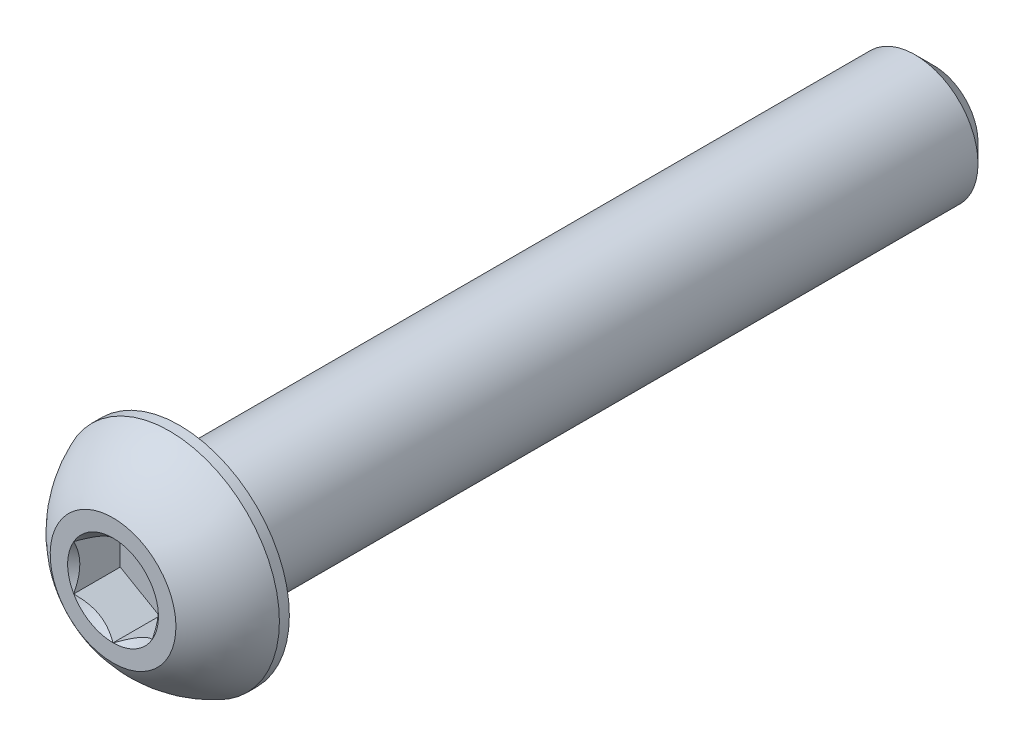
ISO-10303-21;
HEADER;
FILE_DESCRIPTION(('STEP AP214'),'2;1');
FILE_NAME('part.step','',(''),(''),'','','');
FILE_SCHEMA(('AUTOMOTIVE_DESIGN { 1 0 10303 214 1 1 1 1 }'));
ENDSEC;
DATA;
#1=APPLICATION_CONTEXT('core data for automotive mechanical design processes');
#2=APPLICATION_PROTOCOL_DEFINITION('international standard','automotive_design',2000,#1);
#3=PRODUCT_CONTEXT('',#1,'mechanical');
#4=PRODUCT('Part','Part','',(#3));
#5=PRODUCT_RELATED_PRODUCT_CATEGORY('part','',(#4));
#6=PRODUCT_DEFINITION_FORMATION('','',#4);
#7=PRODUCT_DEFINITION_CONTEXT('part definition',#1,'design');
#8=PRODUCT_DEFINITION('design','',#6,#7);
#9=PRODUCT_DEFINITION_SHAPE('','',#8);
#10=(LENGTH_UNIT() NAMED_UNIT(*) SI_UNIT(.MILLI.,.METRE.));
#11=(NAMED_UNIT(*) PLANE_ANGLE_UNIT() SI_UNIT($,.RADIAN.));
#12=(NAMED_UNIT(*) SI_UNIT($,.STERADIAN.) SOLID_ANGLE_UNIT());
#13=UNCERTAINTY_MEASURE_WITH_UNIT(LENGTH_MEASURE(1.E-05),#10,'distance_accuracy_value','');
#14=(GEOMETRIC_REPRESENTATION_CONTEXT(3) GLOBAL_UNCERTAINTY_ASSIGNED_CONTEXT((#13)) GLOBAL_UNIT_ASSIGNED_CONTEXT((#10,
#11,#12)) REPRESENTATION_CONTEXT('',''));
#15=CARTESIAN_POINT('',(0.,0.,0.));
#16=DIRECTION('',(0.,0.,1.));
#17=DIRECTION('',(1.,0.,0.));
#18=AXIS2_PLACEMENT_3D('',#15,#16,#17);
#19=CARTESIAN_POINT('',(0.,-3.175,-41.4528));
#20=DIRECTION('',(0.,0.,-1.));
#21=DIRECTION('',(0.,1.,0.));
#22=AXIS2_PLACEMENT_3D('',#19,#20,#21);
#23=PLANE('',#22);
#24=CARTESIAN_POINT('',(0.,0.,-41.4528));
#25=DIRECTION('',(0.,0.,-1.));
#26=DIRECTION('',(0.,1.,0.));
#27=AXIS2_PLACEMENT_3D('',#24,#25,#26);
#28=CIRCLE('',#27,2.2225);
#29=CARTESIAN_POINT('',(0.,-2.2225,-41.4528));
#30=VERTEX_POINT('',#29);
#31=EDGE_CURVE('E175',#30,#30,#28,.T.);
#32=ORIENTED_EDGE('',*,*,#31,.T.);
#33=EDGE_LOOP('',(#32));
#34=FACE_BOUND('',#33,.T.);
#35=ADVANCED_FACE('F36',(#34),#23,.T.);
#36=CARTESIAN_POINT('',(0.,0.,-41.4528));
#37=DIRECTION('',(0.,0.,-1.));
#38=DIRECTION('',(0.,1.,0.));
#39=AXIS2_PLACEMENT_3D('',#36,#37,#38);
#40=CYLINDRICAL_SURFACE('',#39,3.175);
#41=CARTESIAN_POINT('',(0.,0.,-40.5003));
#42=DIRECTION('',(0.,0.,-1.));
#43=DIRECTION('',(0.,1.,0.));
#44=AXIS2_PLACEMENT_3D('',#41,#42,#43);
#45=CIRCLE('',#44,3.175);
#46=CARTESIAN_POINT('',(0.,-3.175,-40.5003));
#47=VERTEX_POINT('',#46);
#48=EDGE_CURVE('E49',#47,#47,#45,.F.);
#49=ORIENTED_EDGE('',*,*,#48,.T.);
#50=EDGE_LOOP('',(#49));
#51=FACE_BOUND('',#50,.T.);
#52=CARTESIAN_POINT('',(0.,0.,-3.3528));
#53=DIRECTION('',(0.,0.,1.));
#54=DIRECTION('',(1.,0.,0.));
#55=AXIS2_PLACEMENT_3D('',#52,#53,#54);
#56=CIRCLE('',#55,3.175);
#57=CARTESIAN_POINT('',(3.175,0.,-3.3528));
#58=VERTEX_POINT('',#57);
#59=EDGE_CURVE('E172',#58,#58,#56,.F.);
#60=ORIENTED_EDGE('',*,*,#59,.T.);
#61=EDGE_LOOP('',(#60));
#62=FACE_BOUND('',#61,.T.);
#63=ADVANCED_FACE('F180',(#51,#62),#40,.T.);
#64=CARTESIAN_POINT('',(0.,0.,-41.4528));
#65=DIRECTION('',(0.,0.,1.));
#66=DIRECTION('',(0.,-1.,0.));
#67=AXIS2_PLACEMENT_3D('',#64,#65,#66);
#68=CONICAL_SURFACE('',#67,2.2225,0.785398163397447);
#69=CARTESIAN_POINT('',(0.,-3.175,-40.5003));
#70=CARTESIAN_POINT('',(0.,-3.165078125,-40.510221875));
#71=CARTESIAN_POINT('',(0.,-3.15515625,-40.52014375));
#72=CARTESIAN_POINT('',(0.,-3.1353125,-40.5399875));
#73=CARTESIAN_POINT('',(0.,-3.125390625,-40.549909375));
#74=CARTESIAN_POINT('',(0.,-3.105546875,-40.569753125));
#75=CARTESIAN_POINT('',(0.,-3.095625,-40.579675));
#76=CARTESIAN_POINT('',(0.,-3.07578125,-40.59951875));
#77=CARTESIAN_POINT('',(0.,-3.065859375,-40.609440625));
#78=CARTESIAN_POINT('',(0.,-3.046015625,-40.629284375));
#79=CARTESIAN_POINT('',(0.,-3.03609375,-40.63920625));
#80=CARTESIAN_POINT('',(0.,-3.01625,-40.65905));
#81=CARTESIAN_POINT('',(0.,-3.006328125,-40.668971875));
#82=CARTESIAN_POINT('',(0.,-2.986484375,-40.688815625));
#83=CARTESIAN_POINT('',(0.,-2.9765625,-40.6987375));
#84=CARTESIAN_POINT('',(0.,-2.95671875,-40.71858125));
#85=CARTESIAN_POINT('',(0.,-2.946796875,-40.728503125));
#86=CARTESIAN_POINT('',(0.,-2.926953125,-40.748346875));
#87=CARTESIAN_POINT('',(0.,-2.91703125,-40.75826875));
#88=CARTESIAN_POINT('',(0.,-2.8971875,-40.7781125));
#89=CARTESIAN_POINT('',(0.,-2.887265625,-40.788034375));
#90=CARTESIAN_POINT('',(0.,-2.867421875,-40.807878125));
#91=CARTESIAN_POINT('',(0.,-2.8575,-40.8178));
#92=CARTESIAN_POINT('',(0.,-2.83765625,-40.83764375));
#93=CARTESIAN_POINT('',(0.,-2.827734375,-40.847565625));
#94=CARTESIAN_POINT('',(0.,-2.807890625,-40.867409375));
#95=CARTESIAN_POINT('',(0.,-2.79796875,-40.87733125));
#96=CARTESIAN_POINT('',(0.,-2.778125,-40.897175));
#97=CARTESIAN_POINT('',(0.,-2.768203125,-40.907096875));
#98=CARTESIAN_POINT('',(0.,-2.748359375,-40.926940625));
#99=CARTESIAN_POINT('',(0.,-2.7384375,-40.9368625));
#100=CARTESIAN_POINT('',(0.,-2.71859375,-40.95670625));
#101=CARTESIAN_POINT('',(0.,-2.708671875,-40.966628125));
#102=CARTESIAN_POINT('',(0.,-2.688828125,-40.986471875));
#103=CARTESIAN_POINT('',(0.,-2.67890625,-40.99639375));
#104=CARTESIAN_POINT('',(0.,-2.6590625,-41.0162375));
#105=CARTESIAN_POINT('',(0.,-2.649140625,-41.026159375));
#106=CARTESIAN_POINT('',(0.,-2.629296875,-41.046003125));
#107=CARTESIAN_POINT('',(0.,-2.619375,-41.055925));
#108=CARTESIAN_POINT('',(0.,-2.59953125,-41.07576875));
#109=CARTESIAN_POINT('',(0.,-2.589609375,-41.085690625));
#110=CARTESIAN_POINT('',(0.,-2.569765625,-41.105534375));
#111=CARTESIAN_POINT('',(0.,-2.55984375,-41.11545625));
#112=CARTESIAN_POINT('',(0.,-2.54,-41.1353));
#113=CARTESIAN_POINT('',(0.,-2.530078125,-41.145221875));
#114=CARTESIAN_POINT('',(0.,-2.510234375,-41.165065625));
#115=CARTESIAN_POINT('',(0.,-2.5003125,-41.1749875));
#116=CARTESIAN_POINT('',(0.,-2.48046875,-41.19483125));
#117=CARTESIAN_POINT('',(0.,-2.470546875,-41.204753125));
#118=CARTESIAN_POINT('',(0.,-2.450703125,-41.224596875));
#119=CARTESIAN_POINT('',(0.,-2.44078125,-41.23451875));
#120=CARTESIAN_POINT('',(0.,-2.4209375,-41.2543625));
#121=CARTESIAN_POINT('',(0.,-2.411015625,-41.264284375));
#122=CARTESIAN_POINT('',(0.,-2.391171875,-41.284128125));
#123=CARTESIAN_POINT('',(0.,-2.38125,-41.29405));
#124=CARTESIAN_POINT('',(0.,-2.36140625,-41.31389375));
#125=CARTESIAN_POINT('',(0.,-2.351484375,-41.323815625));
#126=CARTESIAN_POINT('',(0.,-2.331640625,-41.343659375));
#127=CARTESIAN_POINT('',(0.,-2.32171875,-41.35358125));
#128=CARTESIAN_POINT('',(0.,-2.301875,-41.373425));
#129=CARTESIAN_POINT('',(0.,-2.291953125,-41.383346875));
#130=CARTESIAN_POINT('',(0.,-2.272109375,-41.403190625));
#131=CARTESIAN_POINT('',(0.,-2.2621875,-41.4131125));
#132=CARTESIAN_POINT('',(0.,-2.24234375,-41.43295625));
#133=CARTESIAN_POINT('',(0.,-2.232421875,-41.442878125));
#134=CARTESIAN_POINT('',(0.,-2.2225,-41.4528));
#135=B_SPLINE_CURVE_WITH_KNOTS('',3,(#69,#70,#71,#72,#73,#74,#75,#76,#77,#78,#79,#80,#81,#82,
#83,#84,#85,#86,#87,#88,#89,#90,#91,#92,#93,#94,#95,#96,#97,#98,#99,#100,#101,#102,#103,#104,
#105,#106,#107,#108,#109,#110,#111,#112,#113,#114,#115,#116,#117,#118,#119,#120,#121,#122,#123,
#124,#125,#126,#127,#128,#129,#130,#131,#132,#133,#134),.UNSPECIFIED.,.F.,.F.,(4,2,2,2,2,2,2,2,
2,2,2,2,2,2,2,2,2,2,2,2,2,2,2,2,2,2,2,2,2,2,2,2,4),(0.,0.0420949505675096,0.0841899011350192,
0.126284851702534,0.168379802270044,0.210474752837558,0.252569703405068,0.294664653972578,
0.336759604540092,0.378854555107602,0.420949505675116,0.463044456242626,0.505139406810136,
0.54723435737765,0.58932930794516,0.631424258512675,0.673519209080185,0.715614159647694,
0.757709110215209,0.799804060782718,0.841899011350233,0.883993961917743,0.926088912485253,
0.968183863052767,1.01027881362028,1.05237376418779,1.0944687147553,1.13656366532281,
1.17865861589033,1.22075356645784,1.26284851702535,1.30494346759286,1.34703841816037),.UNSPECIFIED.);
#136=EDGE_CURVE('BSEAM38',#47,#30,#135,.T.);
#137=ORIENTED_EDGE('',*,*,#48,.F.);
#138=ORIENTED_EDGE('',*,*,#31,.F.);
#139=ORIENTED_EDGE('',*,*,#136,.T.);
#140=ORIENTED_EDGE('',*,*,#136,.F.);
#141=EDGE_LOOP('',(#137,#139,#138,#140));
#142=FACE_BOUND('',#141,.T.);
#143=ADVANCED_FACE('F38',(#142),#68,.T.);
#144=CARTESIAN_POINT('',(0.,0.,-5.060315));
#145=DIRECTION('',(0.,0.,1.));
#146=DIRECTION('',(0.,-1.,0.));
#147=AXIS2_PLACEMENT_3D('',#144,#145,#146);
#148=SPHERICAL_SURFACE('',#147,5.97389428256184);
#149=CARTESIAN_POINT('',(0.,0.,0.));
#150=DIRECTION('',(0.,0.,1.));
#151=DIRECTION('',(1.,0.,0.));
#152=AXIS2_PLACEMENT_3D('',#149,#150,#151);
#153=CIRCLE('',#152,3.175);
#154=CARTESIAN_POINT('',(0.,-3.175,0.));
#155=VERTEX_POINT('',#154);
#156=EDGE_CURVE('E169',#155,#155,#153,.T.);
#157=CARTESIAN_POINT('',(0.,0.,-2.84988));
#158=DIRECTION('',(0.,0.,1.));
#159=DIRECTION('',(1.,0.,0.));
#160=AXIS2_PLACEMENT_3D('',#157,#158,#159);
#161=CIRCLE('',#160,5.5499);
#162=CARTESIAN_POINT('',(0.,-5.5499,-2.84988));
#163=VERTEX_POINT('',#162);
#164=EDGE_CURVE('E163',#163,#163,#161,.T.);
#165=CARTESIAN_POINT('',(0.,-3.175,0.));
#166=CARTESIAN_POINT('',(0.,-3.20828343957184,-0.0208830076580488));
#167=CARTESIAN_POINT('',(0.,-3.24136078860705,-0.0420944789280492));
#168=CARTESIAN_POINT('',(0.,-3.3070905577514,-0.0851658910984713));
#169=CARTESIAN_POINT('',(0.,-3.33974297786056,-0.107025831998893));
#170=CARTESIAN_POINT('',(0.,-3.40461014130008,-0.151385725836676));
#171=CARTESIAN_POINT('',(0.,-3.43682488463043,-0.173885678774038));
#172=CARTESIAN_POINT('',(0.,-3.50080416139461,-0.219516822259478));
#173=CARTESIAN_POINT('',(0.,-3.53256869482844,-0.242648012807557));
#174=CARTESIAN_POINT('',(0.,-3.59563518208834,-0.289532629449102));
#175=CARTESIAN_POINT('',(0.,-3.62693713591442,-0.313286055542568));
#176=CARTESIAN_POINT('',(0.,-3.68906627753106,-0.361405894091329));
#177=CARTESIAN_POINT('',(0.,-3.71989346532163,-0.385772306546625));
#178=CARTESIAN_POINT('',(0.,-3.78106107243204,-0.435108631276876));
#179=CARTESIAN_POINT('',(0.,-3.81140149175189,-0.460078543551832));
#180=CARTESIAN_POINT('',(0.,-3.87158374923259,-0.510612146063937));
#181=CARTESIAN_POINT('',(0.,-3.90142558739343,-0.536175836301086));
#182=CARTESIAN_POINT('',(0.,-3.96059906392414,-0.587887041792083));
#183=CARTESIAN_POINT('',(0.,-3.989930702294,-0.614034557045931));
#184=CARTESIAN_POINT('',(0.,-4.04807235926832,-0.666903232293406));
#185=CARTESIAN_POINT('',(0.,-4.07688237787279,-0.693624392287033));
#186=CARTESIAN_POINT('',(0.,-4.13396957842491,-0.747629953401057));
#187=CARTESIAN_POINT('',(0.,-4.16224676037256,-0.774914354521453));
#188=CARTESIAN_POINT('',(0.,-4.21825727817542,-0.830035774981947));
#189=CARTESIAN_POINT('',(0.,-4.24599061403061,-0.857872794322044));
#190=CARTESIAN_POINT('',(0.,-4.30090264195357,-0.91408861315902));
#191=CARTESIAN_POINT('',(0.,-4.32808133402134,-0.942467412655899));
#192=CARTESIAN_POINT('',(0.,-4.38187349261952,-0.999755742806741));
#193=CARTESIAN_POINT('',(0.,-4.40848695914995,-1.0286652734607));
#194=CARTESIAN_POINT('',(0.,-4.46113830498838,-1.08700381029123));
#195=CARTESIAN_POINT('',(0.,-4.48717618429639,-1.11643281646778));
#196=CARTESIAN_POINT('',(0.,-4.53866621810402,-1.17579884645643));
#197=CARTESIAN_POINT('',(0.,-4.56411837260364,-1.20573587026853));
#198=CARTESIAN_POINT('',(0.,-4.61442704725457,-1.26610627984964));
#199=CARTESIAN_POINT('',(0.,-4.63928356740587,-1.29653966561866));
#200=CARTESIAN_POINT('',(0.,-4.68839129572448,-1.3578909501815));
#201=CARTESIAN_POINT('',(0.,-4.71264250389178,-1.38880884897531));
#202=CARTESIAN_POINT('',(0.,-4.76053016627881,-1.45111712201534));
#203=CARTESIAN_POINT('',(0.,-4.78416662049853,-1.48250749626155));
#204=CARTESIAN_POINT('',(0.,-4.8308155723751,-1.54574849868041));
#205=CARTESIAN_POINT('',(0.,-4.85382807003194,-1.57759912685306));
#206=CARTESIAN_POINT('',(0.,-4.89922014909859,-1.64174823640362));
#207=CARTESIAN_POINT('',(0.,-4.92159973050841,-1.67404671778154));
#208=CARTESIAN_POINT('',(0.,-4.96571726381658,-1.73907895865427));
#209=CARTESIAN_POINT('',(0.,-4.98745521571493,-1.77181271814908));
#210=CARTESIAN_POINT('',(0.,-5.03028102654719,-1.83770277069632));
#211=CARTESIAN_POINT('',(0.,-5.0513688854811,-1.87085906374874));
#212=CARTESIAN_POINT('',(0.,-5.09288630004063,-1.93758127434189));
#213=CARTESIAN_POINT('',(0.,-5.11331585566624,-1.97114719188261));
#214=CARTESIAN_POINT('',(0.,-5.15350870956168,-2.03867558290299));
#215=CARTESIAN_POINT('',(0.,-5.17327200783151,-2.07263805638265));
#216=CARTESIAN_POINT('',(0.,-5.21212465239608,-2.14094633632486));
#217=CARTESIAN_POINT('',(0.,-5.23121399869082,-2.17529214278741));
#218=CARTESIAN_POINT('',(0.,-5.26871130697935,-2.2443537165359));
#219=CARTESIAN_POINT('',(0.,-5.28711926897315,-2.27906948382184));
#220=CARTESIAN_POINT('',(0.,-5.32324664200827,-2.3488574628552));
#221=CARTESIAN_POINT('',(0.,-5.3409660530496,-2.38392967460262));
#222=CARTESIAN_POINT('',(0.,-5.37570942417474,-2.45441688802313));
#223=CARTESIAN_POINT('',(0.,-5.39273338425856,-2.48983188969622));
#224=CARTESIAN_POINT('',(0.,-5.42607922958184,-2.56099089271574));
#225=CARTESIAN_POINT('',(0.,-5.44240111482132,-2.59673489406217));
#226=CARTESIAN_POINT('',(0.,-5.47433643994316,-2.66853798649801));
#227=CARTESIAN_POINT('',(0.,-5.48994987982553,-2.70459707758742));
#228=CARTESIAN_POINT('',(0.,-5.52046229408188,-2.77701628549785));
#229=CARTESIAN_POINT('',(0.,-5.53536126845586,-2.81337640231887));
#230=CARTESIAN_POINT('',(0.,-5.5499,-2.84988));
#231=B_SPLINE_CURVE_WITH_KNOTS('',3,(#165,#166,#167,#168,#169,#170,#171,#172,#173,#174,#175,
#176,#177,#178,#179,#180,#181,#182,#183,#184,#185,#186,#187,#188,#189,#190,#191,#192,#193,#194,
#195,#196,#197,#198,#199,#200,#201,#202,#203,#204,#205,#206,#207,#208,#209,#210,#211,#212,#213,
#214,#215,#216,#217,#218,#219,#220,#221,#222,#223,#224,#225,#226,#227,#228,#229,#230),
.UNSPECIFIED.,.F.,.F.,(4,2,2,2,2,2,2,2,2,2,2,2,2,2,2,2,2,2,2,2,2,2,2,2,2,2,2,2,2,2,2,2,4),(0.,
0.1178750807537,0.2357501615074,0.353625242261099,0.471500323014799,0.589375403768499,
0.707250484522198,0.825125565275897,0.943000646029598,1.0608757267833,1.178750807537,
1.2966258882907,1.41450096904439,1.53237604979809,1.65025113055179,1.76812621130549,
1.88600129205919,2.00387637281289,2.12175145356659,2.23962653432029,2.35750161507399,
2.47537669582769,2.59325177658139,2.71112685733509,2.82900193808879,2.94687701884249,
3.06475209959619,3.18262718034989,3.30050226110359,3.41837734185729,3.53625242261099,
3.65412750336469,3.77200258411839),.UNSPECIFIED.);
#232=EDGE_CURVE('BSEAM185',#155,#163,#231,.T.);
#233=ORIENTED_EDGE('',*,*,#156,.F.);
#234=ORIENTED_EDGE('',*,*,#164,.T.);
#235=ORIENTED_EDGE('',*,*,#232,.T.);
#236=ORIENTED_EDGE('',*,*,#232,.F.);
#237=EDGE_LOOP('',(#233,#235,#234,#236));
#238=FACE_BOUND('',#237,.T.);
#239=ADVANCED_FACE('F185',(#238),#148,.T.);
#240=CARTESIAN_POINT('',(0.,-3.175,0.));
#241=DIRECTION('',(0.,0.,-1.));
#242=DIRECTION('',(-1.,0.,0.));
#243=AXIS2_PLACEMENT_3D('',#240,#241,#242);
#244=PLANE('',#243);
#245=CARTESIAN_POINT('',(0.,0.,0.));
#246=DIRECTION('',(0.,0.,1.));
#247=DIRECTION('',(1.,0.,0.));
#248=AXIS2_PLACEMENT_3D('',#245,#246,#247);
#249=CIRCLE('',#248,2.29135888084633);
#250=CARTESIAN_POINT('',(-1.984375,1.14567944042316,0.));
#251=VERTEX_POINT('',#250);
#252=CARTESIAN_POINT('',(-1.984375,-1.14567944042316,0.));
#253=VERTEX_POINT('',#252);
#254=EDGE_CURVE('E62',#251,#253,#249,.T.);
#255=ORIENTED_EDGE('',*,*,#254,.F.);
#256=CARTESIAN_POINT('',(0.,2.29135888084633,0.));
#257=VERTEX_POINT('',#256);
#258=EDGE_CURVE('E134',#257,#251,#249,.T.);
#259=ORIENTED_EDGE('',*,*,#258,.F.);
#260=CARTESIAN_POINT('',(1.984375,1.14567944042316,0.));
#261=VERTEX_POINT('',#260);
#262=EDGE_CURVE('E131',#261,#257,#249,.T.);
#263=ORIENTED_EDGE('',*,*,#262,.F.);
#264=CARTESIAN_POINT('',(1.984375,-1.14567944042316,0.));
#265=VERTEX_POINT('',#264);
#266=EDGE_CURVE('E102',#265,#261,#249,.T.);
#267=ORIENTED_EDGE('',*,*,#266,.F.);
#268=CARTESIAN_POINT('',(0.,-2.29135888084633,0.));
#269=VERTEX_POINT('',#268);
#270=EDGE_CURVE('E94',#269,#265,#249,.T.);
#271=ORIENTED_EDGE('',*,*,#270,.F.);
#272=EDGE_CURVE('E55',#253,#269,#249,.T.);
#273=ORIENTED_EDGE('',*,*,#272,.F.);
#274=EDGE_LOOP('',(#255,#259,#263,#267,#271,#273));
#275=FACE_BOUND('',#274,.T.);
#276=ORIENTED_EDGE('',*,*,#156,.T.);
#277=EDGE_LOOP('',(#276));
#278=FACE_BOUND('',#277,.T.);
#279=ADVANCED_FACE('F128',(#275,#278),#244,.F.);
#280=CARTESIAN_POINT('',(0.,-5.5499,-3.3528));
#281=DIRECTION('',(0.,0.,1.));
#282=DIRECTION('',(1.,0.,0.));
#283=AXIS2_PLACEMENT_3D('',#280,#281,#282);
#284=PLANE('',#283);
#285=ORIENTED_EDGE('',*,*,#59,.F.);
#286=EDGE_LOOP('',(#285));
#287=FACE_BOUND('',#286,.T.);
#288=CARTESIAN_POINT('',(0.,0.,-3.3528));
#289=DIRECTION('',(0.,0.,1.));
#290=DIRECTION('',(1.,0.,0.));
#291=AXIS2_PLACEMENT_3D('',#288,#289,#290);
#292=CIRCLE('',#291,5.5499);
#293=CARTESIAN_POINT('',(5.5499,0.,-3.3528));
#294=VERTEX_POINT('',#293);
#295=EDGE_CURVE('E166',#294,#294,#292,.T.);
#296=ORIENTED_EDGE('',*,*,#295,.F.);
#297=EDGE_LOOP('',(#296));
#298=FACE_BOUND('',#297,.T.);
#299=ADVANCED_FACE('F199',(#287,#298),#284,.F.);
#300=CARTESIAN_POINT('',(0.,0.,0.));
#301=DIRECTION('',(0.,0.,1.));
#302=DIRECTION('',(1.,0.,0.));
#303=AXIS2_PLACEMENT_3D('',#300,#301,#302);
#304=CYLINDRICAL_SURFACE('',#303,5.5499);
#305=ORIENTED_EDGE('',*,*,#164,.F.);
#306=EDGE_LOOP('',(#305));
#307=FACE_BOUND('',#306,.T.);
#308=ORIENTED_EDGE('',*,*,#295,.T.);
#309=EDGE_LOOP('',(#308));
#310=FACE_BOUND('',#309,.T.);
#311=ADVANCED_FACE('F202',(#307,#310),#304,.T.);
#312=CARTESIAN_POINT('',(0.,0.,0.));
#313=DIRECTION('',(0.,0.,1.));
#314=DIRECTION('',(1.,0.,0.));
#315=AXIS2_PLACEMENT_3D('',#312,#313,#314);
#316=CONICAL_SURFACE('',#315,2.29135888084633,0.78539816339745);
#317=ORIENTED_EDGE('',*,*,#266,.T.);
#318=CARTESIAN_POINT('',(1.984375,-2.28495242157822,0.734984078816568));
#319=CARTESIAN_POINT('',(1.984375,-2.22931635455402,0.692986685550761));
#320=CARTESIAN_POINT('',(1.984375,-2.17336876548389,0.651396054076336));
#321=CARTESIAN_POINT('',(1.984375,-2.06072770258171,0.569208461471479));
#322=CARTESIAN_POINT('',(1.984375,-2.00403404503435,0.528611752405042));
#323=CARTESIAN_POINT('',(1.984375,-1.88936329173488,0.448303503174669));
#324=CARTESIAN_POINT('',(1.984375,-1.83137965519348,0.408601258813307));
#325=CARTESIAN_POINT('',(1.984375,-1.7144280213784,0.330685173401292));
#326=CARTESIAN_POINT('',(1.984375,-1.65546009407228,0.292471227194368));
#327=CARTESIAN_POINT('',(1.984375,-1.47005472306035,0.176252834013636));
#328=CARTESIAN_POINT('',(1.984375,-1.34163909427883,0.101347886872381));
#329=CARTESIAN_POINT('',(1.984375,-1.0784038470548,-0.0356697845602626));
#330=CARTESIAN_POINT('',(1.984375,-0.943607781407425,-0.0978256335176257));
#331=CARTESIAN_POINT('',(1.984375,-0.741275100444882,-0.173867421311381));
#332=CARTESIAN_POINT('',(1.984375,-0.676735408881095,-0.195691938673995));
#333=CARTESIAN_POINT('',(1.984375,-0.546098118112762,-0.234159536462205));
#334=CARTESIAN_POINT('',(1.984375,-0.480000411919956,-0.250802259934452));
#335=CARTESIAN_POINT('',(1.984375,-0.347746170028532,-0.277764619130277));
#336=CARTESIAN_POINT('',(1.984375,-0.281612071479123,-0.288192590264108));
#337=CARTESIAN_POINT('',(1.984375,-0.14863662005235,-0.302521852623404));
#338=CARTESIAN_POINT('',(1.984375,-0.0817953907393235,-0.306424265772614));
#339=CARTESIAN_POINT('',(1.984375,0.0495156750890646,-0.307412948667328));
#340=CARTESIAN_POINT('',(1.984375,0.113983775102992,-0.304740821124985));
#341=CARTESIAN_POINT('',(1.984375,0.242367515846177,-0.293260789502485));
#342=CARTESIAN_POINT('',(1.984375,0.30628310229592,-0.284452289360786));
#343=CARTESIAN_POINT('',(1.984375,0.434181040262184,-0.261030978667103));
#344=CARTESIAN_POINT('',(1.984375,0.498145026858309,-0.246319393767914));
#345=CARTESIAN_POINT('',(1.984375,0.624675616953007,-0.211873818587874));
#346=CARTESIAN_POINT('',(1.984375,0.687242336899689,-0.192140248550805));
#347=CARTESIAN_POINT('',(1.984375,0.884225483826087,-0.12258776276924));
#348=CARTESIAN_POINT('',(1.984375,1.01583674256468,-0.0648475887435035));
#349=CARTESIAN_POINT('',(1.984375,1.27288659242652,0.0635303365887973));
#350=CARTESIAN_POINT('',(1.984375,1.3983008827048,0.134214424919412));
#351=CARTESIAN_POINT('',(1.984375,1.57956687990221,0.244516663813198));
#352=CARTESIAN_POINT('',(1.984375,1.63738271299424,0.280969829475363));
#353=CARTESIAN_POINT('',(1.984375,1.75202215386201,0.355415963291704));
#354=CARTESIAN_POINT('',(1.984375,1.80884568601361,0.393409048078053));
#355=CARTESIAN_POINT('',(1.984375,1.92116923084255,0.470338808893089));
#356=CARTESIAN_POINT('',(1.984375,1.97667624512253,0.50926531303879));
#357=CARTESIAN_POINT('',(1.984375,2.08693170717166,0.588147746121385));
#358=CARTESIAN_POINT('',(1.984375,2.14168035934792,0.628103389024029));
#359=CARTESIAN_POINT('',(1.984375,2.19611149046622,0.668480611285425));
#360=B_SPLINE_CURVE_WITH_KNOTS('',3,(#318,#319,#320,#321,#322,#323,#324,#325,#326,#327,#328,
#329,#330,#331,#332,#333,#334,#335,#336,#337,#338,#339,#340,#341,#342,#343,#344,#345,#346,#347,
#348,#349,#350,#351,#352,#353,#354,#355,#356,#357,#358,#359),.UNSPECIFIED.,.F.,.F.,(4,2,2,2,2,2,
2,2,2,2,2,2,2,2,2,2,2,2,2,2,4),(0.,0.209126070008322,0.418304637356569,0.629103979977992,
0.839888401371185,1.28549951116127,1.72957750768351,1.93379389749971,2.13802435186698,
2.33858179514334,2.53910475350639,2.73236963400794,2.92565329006887,3.12231577097487,
3.31896180041345,3.74886295245172,4.18033428125362,4.3853601718029,4.59040161996382,
4.79377749165107,4.99709743524131),.UNSPECIFIED.);
#361=EDGE_CURVE('E11',#265,#261,#360,.T.);
#362=ORIENTED_EDGE('',*,*,#361,.F.);
#363=EDGE_LOOP('',(#317,#362));
#364=FACE_BOUND('',#363,.T.);
#365=ADVANCED_FACE('F106',(#364),#316,.F.);
#366=ORIENTED_EDGE('',*,*,#262,.T.);
#367=CARTESIAN_POINT('',(1.984575,1.14556397036933,0.000115478781843379));
#368=CARTESIAN_POINT('',(1.9163590048332,1.18494849354192,-0.0392371477360852));
#369=CARTESIAN_POINT('',(1.84700231489303,1.22499159714897,-0.0762786895538154));
#370=CARTESIAN_POINT('',(1.70557619954781,1.30664400291398,-0.144101141576677));
#371=CARTESIAN_POINT('',(1.63349332126322,1.34826107209555,-0.174844310908246));
#372=CARTESIAN_POINT('',(1.488141602734,1.43217992591557,-0.227508111188786));
#373=CARTESIAN_POINT('',(1.41490978751306,1.47446033414663,-0.249561124120036));
#374=CARTESIAN_POINT('',(1.26683381740529,1.55995203534886,-0.283538507056124));
#375=CARTESIAN_POINT('',(1.19199418724658,1.60316071596705,-0.295488243908272));
#376=CARTESIAN_POINT('',(1.06301458545618,1.6776271237807,-0.306269900918094));
#377=CARTESIAN_POINT('',(1.00904128422756,1.7087886237741,-0.30786610094093));
#378=CARTESIAN_POINT('',(0.901182881480199,1.77106070163465,-0.305178161134708));
#379=CARTESIAN_POINT('',(0.847297817514476,1.80217125782056,-0.300891959659541));
#380=CARTESIAN_POINT('',(0.740036461751395,1.86409863044402,-0.286683126986481));
#381=CARTESIAN_POINT('',(0.686660807239859,1.89491507894443,-0.276754189547727));
#382=CARTESIAN_POINT('',(0.580832482591103,1.95601509066828,-0.251804915725461));
#383=CARTESIAN_POINT('',(0.528379742028898,1.9862986945516,-0.236784969610512));
#384=CARTESIAN_POINT('',(0.394017661036351,2.06387267818152,-0.19219214836433));
#385=CARTESIAN_POINT('',(0.312941642841675,2.11068193911104,-0.159257004061668));
#386=CARTESIAN_POINT('',(0.19372669327016,2.17951072233758,-0.103657558797803));
#387=CARTESIAN_POINT('',(0.154440075613998,2.20219286161692,-0.0841224079481377));
#388=CARTESIAN_POINT('',(0.0765946381319466,2.24713694590237,-0.0432712618805983));
#389=CARTESIAN_POINT('',(0.0380353888983007,2.26939913882716,-0.0219563604316494));
#390=CARTESIAN_POINT('',(-0.000200000000000694,2.29147435090017,0.000115478781842942));
#391=B_SPLINE_CURVE_WITH_KNOTS('',3,(#367,#368,#369,#370,#371,#372,#373,#374,#375,#376,#377,
#378,#379,#380,#381,#382,#383,#384,#385,#386,#387,#388,#389,#390),.UNSPECIFIED.,.F.,.F.,(4,2,2,
2,2,2,2,2,2,2,2,4),(0.,0.264339630306627,0.530219665093694,0.791876416371461,1.05287424418109,
1.239639843932,1.42647091743852,1.61351120244035,1.8005371524754,2.09764209964316,
2.24579179873714,2.39385111134157),.UNSPECIFIED.);
#392=EDGE_CURVE('E133',#261,#257,#391,.T.);
#393=ORIENTED_EDGE('',*,*,#392,.F.);
#394=EDGE_LOOP('',(#366,#393));
#395=FACE_BOUND('',#394,.T.);
#396=ADVANCED_FACE('F282',(#395),#316,.F.);
#397=ORIENTED_EDGE('',*,*,#258,.T.);
#398=CARTESIAN_POINT('',(0.000199999999999584,2.29147435090017,0.000115478781843248));
#399=CARTESIAN_POINT('',(-0.0680159951668027,2.25208982772757,-0.0392371477360854));
#400=CARTESIAN_POINT('',(-0.137372685106966,2.21204672412052,-0.0762786895538155));
#401=CARTESIAN_POINT('',(-0.278798800452188,2.13039431835551,-0.144101141576677));
#402=CARTESIAN_POINT('',(-0.350881678736783,2.08877724917394,-0.174844310908246));
#403=CARTESIAN_POINT('',(-0.496233397266004,2.00485839535392,-0.227508111188786));
#404=CARTESIAN_POINT('',(-0.569465212486939,1.96257798712287,-0.249561124120036));
#405=CARTESIAN_POINT('',(-0.717541182594707,1.87708628592063,-0.283538507056124));
#406=CARTESIAN_POINT('',(-0.792380812753425,1.83387760530244,-0.295488243908272));
#407=CARTESIAN_POINT('',(-0.921360414543816,1.75941119748879,-0.306269900918094));
#408=CARTESIAN_POINT('',(-0.975333715772443,1.72824969749539,-0.307866100940931));
#409=CARTESIAN_POINT('',(-1.0831921185198,1.66597761963484,-0.305178161134708));
#410=CARTESIAN_POINT('',(-1.13707718248552,1.63486706344893,-0.300891959659541));
#411=CARTESIAN_POINT('',(-1.2443385382486,1.57293969082547,-0.286683126986481));
#412=CARTESIAN_POINT('',(-1.29771419276014,1.54212324232506,-0.276754189547727));
#413=CARTESIAN_POINT('',(-1.4035425174089,1.48102323060122,-0.251804915725462));
#414=CARTESIAN_POINT('',(-1.4559952579711,1.45073962671789,-0.236784969610512));
#415=CARTESIAN_POINT('',(-1.59035733896365,1.37316564308797,-0.19219214836433));
#416=CARTESIAN_POINT('',(-1.67143335715832,1.32635638215845,-0.159257004061668));
#417=CARTESIAN_POINT('',(-1.79064830672984,1.25752759893191,-0.103657558797804));
#418=CARTESIAN_POINT('',(-1.829934924386,1.23484545965257,-0.0841224079481378));
#419=CARTESIAN_POINT('',(-1.90778036186805,1.18990137536712,-0.0432712618805986));
#420=CARTESIAN_POINT('',(-1.9463396111017,1.16763918244233,-0.0219563604316498));
#421=CARTESIAN_POINT('',(-1.984575,1.14556397036933,0.000115478781842511));
#422=B_SPLINE_CURVE_WITH_KNOTS('',3,(#398,#399,#400,#401,#402,#403,#404,#405,#406,#407,#408,
#409,#410,#411,#412,#413,#414,#415,#416,#417,#418,#419,#420,#421),.UNSPECIFIED.,.F.,.F.,(4,2,2,
2,2,2,2,2,2,2,2,4),(0.,0.264339630306627,0.530219665093694,0.791876416371461,1.05287424418109,
1.239639843932,1.42647091743852,1.61351120244035,1.8005371524754,2.09764209964316,
2.24579179873714,2.39385111134157),.UNSPECIFIED.);
#423=EDGE_CURVE('E138',#257,#251,#422,.T.);
#424=ORIENTED_EDGE('',*,*,#423,.F.);
#425=EDGE_LOOP('',(#397,#424));
#426=FACE_BOUND('',#425,.T.);
#427=ADVANCED_FACE('F141',(#426),#316,.F.);
#428=ORIENTED_EDGE('',*,*,#254,.T.);
#429=CARTESIAN_POINT('',(-1.984375,-2.28495242157822,0.734984078816568));
#430=CARTESIAN_POINT('',(-1.984375,-2.22931635455402,0.692986685550762));
#431=CARTESIAN_POINT('',(-1.984375,-2.17336876548389,0.651396054076336));
#432=CARTESIAN_POINT('',(-1.984375,-2.06072770258171,0.569208461471479));
#433=CARTESIAN_POINT('',(-1.984375,-2.00403404503435,0.528611752405043));
#434=CARTESIAN_POINT('',(-1.984375,-1.88936329173489,0.448303503174669));
#435=CARTESIAN_POINT('',(-1.984375,-1.83137965519348,0.408601258813307));
#436=CARTESIAN_POINT('',(-1.984375,-1.7144280213784,0.330685173401292));
#437=CARTESIAN_POINT('',(-1.984375,-1.65546009407228,0.292471227194368));
#438=CARTESIAN_POINT('',(-1.984375,-1.47005472306035,0.176252834013636));
#439=CARTESIAN_POINT('',(-1.984375,-1.34163909427883,0.101347886872381));
#440=CARTESIAN_POINT('',(-1.984375,-1.0784038470548,-0.0356697845602625));
#441=CARTESIAN_POINT('',(-1.984375,-0.943607781407425,-0.0978256335176254));
#442=CARTESIAN_POINT('',(-1.984375,-0.741275100444882,-0.173867421311381));
#443=CARTESIAN_POINT('',(-1.984375,-0.676735408881095,-0.195691938673995));
#444=CARTESIAN_POINT('',(-1.984375,-0.546098118112762,-0.234159536462205));
#445=CARTESIAN_POINT('',(-1.984375,-0.480000411919956,-0.250802259934452));
#446=CARTESIAN_POINT('',(-1.984375,-0.347746170028532,-0.277764619130277));
#447=CARTESIAN_POINT('',(-1.984375,-0.281612071479123,-0.288192590264108));
#448=CARTESIAN_POINT('',(-1.984375,-0.14863662005235,-0.302521852623404));
#449=CARTESIAN_POINT('',(-1.984375,-0.0817953907393238,-0.306424265772614));
#450=CARTESIAN_POINT('',(-1.984375,0.0495156750890643,-0.307412948667328));
#451=CARTESIAN_POINT('',(-1.984375,0.113983775102991,-0.304740821124985));
#452=CARTESIAN_POINT('',(-1.984375,0.242367515846177,-0.293260789502485));
#453=CARTESIAN_POINT('',(-1.984375,0.306283102295919,-0.284452289360786));
#454=CARTESIAN_POINT('',(-1.984375,0.434181040262184,-0.261030978667103));
#455=CARTESIAN_POINT('',(-1.984375,0.498145026858309,-0.246319393767914));
#456=CARTESIAN_POINT('',(-1.984375,0.624675616953007,-0.211873818587874));
#457=CARTESIAN_POINT('',(-1.984375,0.687242336899689,-0.192140248550805));
#458=CARTESIAN_POINT('',(-1.984375,0.884225483826087,-0.12258776276924));
#459=CARTESIAN_POINT('',(-1.984375,1.01583674256468,-0.0648475887435032));
#460=CARTESIAN_POINT('',(-1.984375,1.27288659242652,0.0635303365887978));
#461=CARTESIAN_POINT('',(-1.984375,1.3983008827048,0.134214424919412));
#462=CARTESIAN_POINT('',(-1.984375,1.57956687990221,0.244516663813198));
#463=CARTESIAN_POINT('',(-1.984375,1.63738271299424,0.280969829475363));
#464=CARTESIAN_POINT('',(-1.984375,1.75202215386202,0.355415963291704));
#465=CARTESIAN_POINT('',(-1.984375,1.80884568601362,0.393409048078053));
#466=CARTESIAN_POINT('',(-1.984375,1.92116923084255,0.47033880889309));
#467=CARTESIAN_POINT('',(-1.984375,1.97667624512253,0.509265313038791));
#468=CARTESIAN_POINT('',(-1.984375,2.08693170717166,0.588147746121386));
#469=CARTESIAN_POINT('',(-1.984375,2.14168035934793,0.628103389024029));
#470=CARTESIAN_POINT('',(-1.984375,2.19611149046622,0.668480611285426));
#471=B_SPLINE_CURVE_WITH_KNOTS('',3,(#429,#430,#431,#432,#433,#434,#435,#436,#437,#438,#439,
#440,#441,#442,#443,#444,#445,#446,#447,#448,#449,#450,#451,#452,#453,#454,#455,#456,#457,#458,
#459,#460,#461,#462,#463,#464,#465,#466,#467,#468,#469,#470),.UNSPECIFIED.,.F.,.F.,(4,2,2,2,2,2,
2,2,2,2,2,2,2,2,2,2,2,2,2,2,4),(0.,0.209126070008322,0.41830463735657,0.629103979977993,
0.839888401371186,1.28549951116127,1.72957750768351,1.93379389749972,2.13802435186698,
2.33858179514334,2.53910475350639,2.73236963400794,2.92565329006887,3.12231577097487,
3.31896180041345,3.74886295245172,4.18033428125362,4.3853601718029,4.59040161996383,
4.79377749165108,4.99709743524131),.UNSPECIFIED.);
#472=EDGE_CURVE('E145',#251,#253,#471,.F.);
#473=ORIENTED_EDGE('',*,*,#472,.F.);
#474=EDGE_LOOP('',(#428,#473));
#475=FACE_BOUND('',#474,.T.);
#476=ADVANCED_FACE('F276',(#475),#316,.F.);
#477=ORIENTED_EDGE('',*,*,#272,.T.);
#478=CARTESIAN_POINT('',(-1.984575,-1.14556397036933,0.000115478781842946));
#479=CARTESIAN_POINT('',(-1.9163590048332,-1.18494849354192,-0.0392371477360854));
#480=CARTESIAN_POINT('',(-1.84700231489303,-1.22499159714897,-0.0762786895538155));
#481=CARTESIAN_POINT('',(-1.70557619954781,-1.30664400291398,-0.144101141576677));
#482=CARTESIAN_POINT('',(-1.63349332126322,-1.34826107209555,-0.174844310908246));
#483=CARTESIAN_POINT('',(-1.488141602734,-1.43217992591557,-0.227508111188786));
#484=CARTESIAN_POINT('',(-1.41490978751306,-1.47446033414662,-0.249561124120036));
#485=CARTESIAN_POINT('',(-1.26683381740529,-1.55995203534886,-0.283538507056125));
#486=CARTESIAN_POINT('',(-1.19199418724658,-1.60316071596705,-0.295488243908272));
#487=CARTESIAN_POINT('',(-1.06301458545618,-1.6776271237807,-0.306269900918095));
#488=CARTESIAN_POINT('',(-1.00904128422756,-1.7087886237741,-0.307866100940931));
#489=CARTESIAN_POINT('',(-0.9011828814802,-1.77106070163465,-0.305178161134708));
#490=CARTESIAN_POINT('',(-0.847297817514477,-1.80217125782056,-0.300891959659541));
#491=CARTESIAN_POINT('',(-0.740036461751396,-1.86409863044402,-0.286683126986481));
#492=CARTESIAN_POINT('',(-0.68666080723986,-1.89491507894443,-0.276754189547728));
#493=CARTESIAN_POINT('',(-0.580832482591103,-1.95601509066827,-0.251804915725462));
#494=CARTESIAN_POINT('',(-0.528379742028898,-1.9862986945516,-0.236784969610513));
#495=CARTESIAN_POINT('',(-0.394017661036351,-2.06387267818152,-0.192192148364331));
#496=CARTESIAN_POINT('',(-0.312941642841675,-2.11068193911104,-0.159257004061668));
#497=CARTESIAN_POINT('',(-0.19372669327016,-2.17951072233758,-0.103657558797804));
#498=CARTESIAN_POINT('',(-0.154440075613998,-2.20219286161692,-0.0841224079481377));
#499=CARTESIAN_POINT('',(-0.0765946381319458,-2.24713694590237,-0.0432712618805983));
#500=CARTESIAN_POINT('',(-0.0380353888982999,-2.26939913882716,-0.0219563604316494));
#501=CARTESIAN_POINT('',(0.000200000000001552,-2.29147435090017,0.000115478781842944));
#502=B_SPLINE_CURVE_WITH_KNOTS('',3,(#478,#479,#480,#481,#482,#483,#484,#485,#486,#487,#488,
#489,#490,#491,#492,#493,#494,#495,#496,#497,#498,#499,#500,#501),.UNSPECIFIED.,.F.,.F.,(4,2,2,
2,2,2,2,2,2,2,2,4),(0.,0.264339630306627,0.530219665093694,0.79187641637146,1.05287424418109,
1.239639843932,1.42647091743852,1.61351120244035,1.8005371524754,2.09764209964316,
2.24579179873714,2.39385111134157),.UNSPECIFIED.);
#503=EDGE_CURVE('E118',#253,#269,#502,.T.);
#504=ORIENTED_EDGE('',*,*,#503,.F.);
#505=EDGE_LOOP('',(#477,#504));
#506=FACE_BOUND('',#505,.T.);
#507=ADVANCED_FACE('F227',(#506),#316,.F.);
#508=ORIENTED_EDGE('',*,*,#270,.T.);
#509=CARTESIAN_POINT('',(-0.000199999999998723,-2.29147435090017,0.000115478781843248));
#510=CARTESIAN_POINT('',(0.0680159951668037,-2.25208982772757,-0.0392371477360849));
#511=CARTESIAN_POINT('',(0.137372685106967,-2.21204672412052,-0.076278689553815));
#512=CARTESIAN_POINT('',(0.278798800452189,-2.13039431835551,-0.144101141576677));
#513=CARTESIAN_POINT('',(0.350881678736784,-2.08877724917394,-0.174844310908246));
#514=CARTESIAN_POINT('',(0.496233397266005,-2.00485839535392,-0.227508111188786));
#515=CARTESIAN_POINT('',(0.56946521248694,-1.96257798712287,-0.249561124120036));
#516=CARTESIAN_POINT('',(0.717541182594708,-1.87708628592063,-0.283538507056124));
#517=CARTESIAN_POINT('',(0.792380812753426,-1.83387760530244,-0.295488243908271));
#518=CARTESIAN_POINT('',(0.921360414543817,-1.75941119748879,-0.306269900918094));
#519=CARTESIAN_POINT('',(0.975333715772444,-1.72824969749539,-0.30786610094093));
#520=CARTESIAN_POINT('',(1.0831921185198,-1.66597761963484,-0.305178161134707));
#521=CARTESIAN_POINT('',(1.13707718248553,-1.63486706344893,-0.30089195965954));
#522=CARTESIAN_POINT('',(1.24433853824861,-1.57293969082547,-0.286683126986481));
#523=CARTESIAN_POINT('',(1.29771419276014,-1.54212324232506,-0.276754189547727));
#524=CARTESIAN_POINT('',(1.4035425174089,-1.48102323060122,-0.251804915725461));
#525=CARTESIAN_POINT('',(1.4559952579711,-1.45073962671789,-0.236784969610511));
#526=CARTESIAN_POINT('',(1.59035733896365,-1.37316564308797,-0.192192148364329));
#527=CARTESIAN_POINT('',(1.67143335715833,-1.32635638215845,-0.159257004061667));
#528=CARTESIAN_POINT('',(1.79064830672984,-1.25752759893191,-0.103657558797803));
#529=CARTESIAN_POINT('',(1.829934924386,-1.23484545965257,-0.0841224079481373));
#530=CARTESIAN_POINT('',(1.90778036186805,-1.18990137536712,-0.0432712618805982));
#531=CARTESIAN_POINT('',(1.9463396111017,-1.16763918244233,-0.0219563604316493));
#532=CARTESIAN_POINT('',(1.984575,-1.14556397036933,0.000115478781843057));
#533=B_SPLINE_CURVE_WITH_KNOTS('',3,(#509,#510,#511,#512,#513,#514,#515,#516,#517,#518,#519,
#520,#521,#522,#523,#524,#525,#526,#527,#528,#529,#530,#531,#532),.UNSPECIFIED.,.F.,.F.,(4,2,2,
2,2,2,2,2,2,2,2,4),(0.,0.264339630306627,0.530219665093694,0.791876416371461,1.05287424418109,
1.239639843932,1.42647091743852,1.61351120244035,1.8005371524754,2.09764209964316,
2.24579179873714,2.39385111134157),.UNSPECIFIED.);
#534=EDGE_CURVE('E98',#269,#265,#533,.T.);
#535=ORIENTED_EDGE('',*,*,#534,.F.);
#536=EDGE_LOOP('',(#508,#535));
#537=FACE_BOUND('',#536,.T.);
#538=ADVANCED_FACE('F96',(#537),#316,.F.);
#539=CARTESIAN_POINT('',(1.984375,-1.14567944042316,-2.34696));
#540=DIRECTION('',(0.,0.,1.));
#541=DIRECTION('',(1.,0.,0.));
#542=AXIS2_PLACEMENT_3D('',#539,#540,#541);
#543=PLANE('',#542);
#544=DIRECTION('',(0.866025403784438,0.5,0.));
#545=VECTOR('',#544,1.);
#546=CARTESIAN_POINT('',(0.,-2.29135888084633,-2.34696));
#547=LINE('',#546,#545);
#548=CARTESIAN_POINT('',(0.,-2.29135888084633,-2.34696));
#549=VERTEX_POINT('',#548);
#550=CARTESIAN_POINT('',(1.984375,-1.14567944042316,-2.34696));
#551=VERTEX_POINT('',#550);
#552=EDGE_CURVE('E117',#549,#551,#547,.T.);
#553=ORIENTED_EDGE('',*,*,#552,.T.);
#554=DIRECTION('',(0.,1.,0.));
#555=VECTOR('',#554,1.);
#556=CARTESIAN_POINT('',(1.984375,-1.14567944042316,-2.34696));
#557=LINE('',#556,#555);
#558=CARTESIAN_POINT('',(1.984375,1.14567944042316,-2.34696));
#559=VERTEX_POINT('',#558);
#560=EDGE_CURVE('E122',#551,#559,#557,.T.);
#561=ORIENTED_EDGE('',*,*,#560,.T.);
#562=DIRECTION('',(-0.866025403784439,0.5,0.));
#563=VECTOR('',#562,1.);
#564=CARTESIAN_POINT('',(1.984375,1.14567944042316,-2.34696));
#565=LINE('',#564,#563);
#566=CARTESIAN_POINT('',(0.,2.29135888084633,-2.34696));
#567=VERTEX_POINT('',#566);
#568=EDGE_CURVE('E266',#559,#567,#565,.T.);
#569=ORIENTED_EDGE('',*,*,#568,.T.);
#570=DIRECTION('',(-0.866025403784438,-0.5,0.));
#571=VECTOR('',#570,1.);
#572=CARTESIAN_POINT('',(0.,2.29135888084633,-2.34696));
#573=LINE('',#572,#571);
#574=CARTESIAN_POINT('',(-1.984375,1.14567944042316,-2.34696));
#575=VERTEX_POINT('',#574);
#576=EDGE_CURVE('E154',#567,#575,#573,.T.);
#577=ORIENTED_EDGE('',*,*,#576,.T.);
#578=DIRECTION('',(0.,-1.,0.));
#579=VECTOR('',#578,1.);
#580=CARTESIAN_POINT('',(-1.984375,1.14567944042316,-2.34696));
#581=LINE('',#580,#579);
#582=CARTESIAN_POINT('',(-1.984375,-1.14567944042316,-2.34696));
#583=VERTEX_POINT('',#582);
#584=EDGE_CURVE('E270',#575,#583,#581,.T.);
#585=ORIENTED_EDGE('',*,*,#584,.T.);
#586=DIRECTION('',(0.866025403784439,-0.5,0.));
#587=VECTOR('',#586,1.);
#588=CARTESIAN_POINT('',(-1.984375,-1.14567944042316,-2.34696));
#589=LINE('',#588,#587);
#590=EDGE_CURVE('E125',#583,#549,#589,.T.);
#591=ORIENTED_EDGE('',*,*,#590,.T.);
#592=EDGE_LOOP('',(#553,#561,#569,#577,#585,#591));
#593=FACE_BOUND('',#592,.T.);
#594=ADVANCED_FACE('F226',(#593),#543,.T.);
#595=CARTESIAN_POINT('',(1.984375,-1.14567944042316,-2.34696));
#596=DIRECTION('',(1.,0.,0.));
#597=DIRECTION('',(0.,0.,-1.));
#598=AXIS2_PLACEMENT_3D('',#595,#596,#597);
#599=PLANE('',#598);
#600=DIRECTION('',(0.,0.,1.));
#601=VECTOR('',#600,1.);
#602=CARTESIAN_POINT('',(1.984375,-1.14567944042316,-2.34696));
#603=LINE('',#602,#601);
#604=EDGE_CURVE('E114',#551,#265,#603,.T.);
#605=ORIENTED_EDGE('',*,*,#604,.T.);
#606=ORIENTED_EDGE('',*,*,#361,.T.);
#607=DIRECTION('',(0.,0.,1.));
#608=VECTOR('',#607,1.);
#609=CARTESIAN_POINT('',(1.984375,1.14567944042316,-2.34696));
#610=LINE('',#609,#608);
#611=EDGE_CURVE('E124',#559,#261,#610,.T.);
#612=ORIENTED_EDGE('',*,*,#611,.F.);
#613=ORIENTED_EDGE('',*,*,#560,.F.);
#614=EDGE_LOOP('',(#605,#606,#612,#613));
#615=FACE_BOUND('',#614,.T.);
#616=ADVANCED_FACE('F120',(#615),#599,.F.);
#617=CARTESIAN_POINT('',(1.984375,1.14567944042316,-2.34696));
#618=DIRECTION('',(0.5,0.866025403784439,0.));
#619=DIRECTION('',(-0.866025403784439,0.5,0.));
#620=AXIS2_PLACEMENT_3D('',#617,#618,#619);
#621=PLANE('',#620);
#622=ORIENTED_EDGE('',*,*,#611,.T.);
#623=ORIENTED_EDGE('',*,*,#392,.T.);
#624=DIRECTION('',(0.,0.,1.));
#625=VECTOR('',#624,1.);
#626=CARTESIAN_POINT('',(0.,2.29135888084633,-2.34696));
#627=LINE('',#626,#625);
#628=EDGE_CURVE('E150',#567,#257,#627,.T.);
#629=ORIENTED_EDGE('',*,*,#628,.F.);
#630=ORIENTED_EDGE('',*,*,#568,.F.);
#631=EDGE_LOOP('',(#622,#623,#629,#630));
#632=FACE_BOUND('',#631,.T.);
#633=ADVANCED_FACE('F148',(#632),#621,.F.);
#634=CARTESIAN_POINT('',(0.,2.29135888084633,-2.34696));
#635=DIRECTION('',(-0.5,0.866025403784438,0.));
#636=DIRECTION('',(-0.866025403784438,-0.5,0.));
#637=AXIS2_PLACEMENT_3D('',#634,#635,#636);
#638=PLANE('',#637);
#639=ORIENTED_EDGE('',*,*,#628,.T.);
#640=ORIENTED_EDGE('',*,*,#423,.T.);
#641=DIRECTION('',(0.,0.,1.));
#642=VECTOR('',#641,1.);
#643=CARTESIAN_POINT('',(-1.984375,1.14567944042316,-2.34696));
#644=LINE('',#643,#642);
#645=EDGE_CURVE('E156',#575,#251,#644,.T.);
#646=ORIENTED_EDGE('',*,*,#645,.F.);
#647=ORIENTED_EDGE('',*,*,#576,.F.);
#648=EDGE_LOOP('',(#639,#640,#646,#647));
#649=FACE_BOUND('',#648,.T.);
#650=ADVANCED_FACE('F152',(#649),#638,.F.);
#651=CARTESIAN_POINT('',(-1.984375,1.14567944042316,-2.34696));
#652=DIRECTION('',(-1.,0.,0.));
#653=DIRECTION('',(0.,0.,1.));
#654=AXIS2_PLACEMENT_3D('',#651,#652,#653);
#655=PLANE('',#654);
#656=ORIENTED_EDGE('',*,*,#645,.T.);
#657=ORIENTED_EDGE('',*,*,#472,.T.);
#658=DIRECTION('',(0.,0.,1.));
#659=VECTOR('',#658,1.);
#660=CARTESIAN_POINT('',(-1.984375,-1.14567944042316,-2.34696));
#661=LINE('',#660,#659);
#662=EDGE_CURVE('E158',#583,#253,#661,.T.);
#663=ORIENTED_EDGE('',*,*,#662,.F.);
#664=ORIENTED_EDGE('',*,*,#584,.F.);
#665=EDGE_LOOP('',(#656,#657,#663,#664));
#666=FACE_BOUND('',#665,.T.);
#667=ADVANCED_FACE('F245',(#666),#655,.F.);
#668=CARTESIAN_POINT('',(-1.984375,-1.14567944042316,-2.34696));
#669=DIRECTION('',(-0.5,-0.866025403784439,0.));
#670=DIRECTION('',(0.866025403784439,-0.5,0.));
#671=AXIS2_PLACEMENT_3D('',#668,#669,#670);
#672=PLANE('',#671);
#673=ORIENTED_EDGE('',*,*,#662,.T.);
#674=ORIENTED_EDGE('',*,*,#503,.T.);
#675=DIRECTION('',(0.,0.,1.));
#676=VECTOR('',#675,1.);
#677=CARTESIAN_POINT('',(0.,-2.29135888084633,-2.34696));
#678=LINE('',#677,#676);
#679=EDGE_CURVE('E116',#549,#269,#678,.T.);
#680=ORIENTED_EDGE('',*,*,#679,.F.);
#681=ORIENTED_EDGE('',*,*,#590,.F.);
#682=EDGE_LOOP('',(#673,#674,#680,#681));
#683=FACE_BOUND('',#682,.T.);
#684=ADVANCED_FACE('F209',(#683),#672,.F.);
#685=CARTESIAN_POINT('',(0.,-2.29135888084633,-2.34696));
#686=DIRECTION('',(0.5,-0.866025403784438,0.));
#687=DIRECTION('',(0.866025403784438,0.5,0.));
#688=AXIS2_PLACEMENT_3D('',#685,#686,#687);
#689=PLANE('',#688);
#690=ORIENTED_EDGE('',*,*,#679,.T.);
#691=ORIENTED_EDGE('',*,*,#534,.T.);
#692=ORIENTED_EDGE('',*,*,#604,.F.);
#693=ORIENTED_EDGE('',*,*,#552,.F.);
#694=EDGE_LOOP('',(#690,#691,#692,#693));
#695=FACE_BOUND('',#694,.T.);
#696=ADVANCED_FACE('F112',(#695),#689,.F.);
#697=CLOSED_SHELL('',(#35,#63,#143,#239,#279,#299,#311,#365,#396,#427,#476,#507,#538,#594,#616,
#633,#650,#667,#684,#696));
#698=MANIFOLD_SOLID_BREP('B2',#697);
#699=ADVANCED_BREP_SHAPE_REPRESENTATION('',(#18,#698),#14);
#700=SHAPE_DEFINITION_REPRESENTATION(#9,#699);
ENDSEC;
END-ISO-10303-21;
